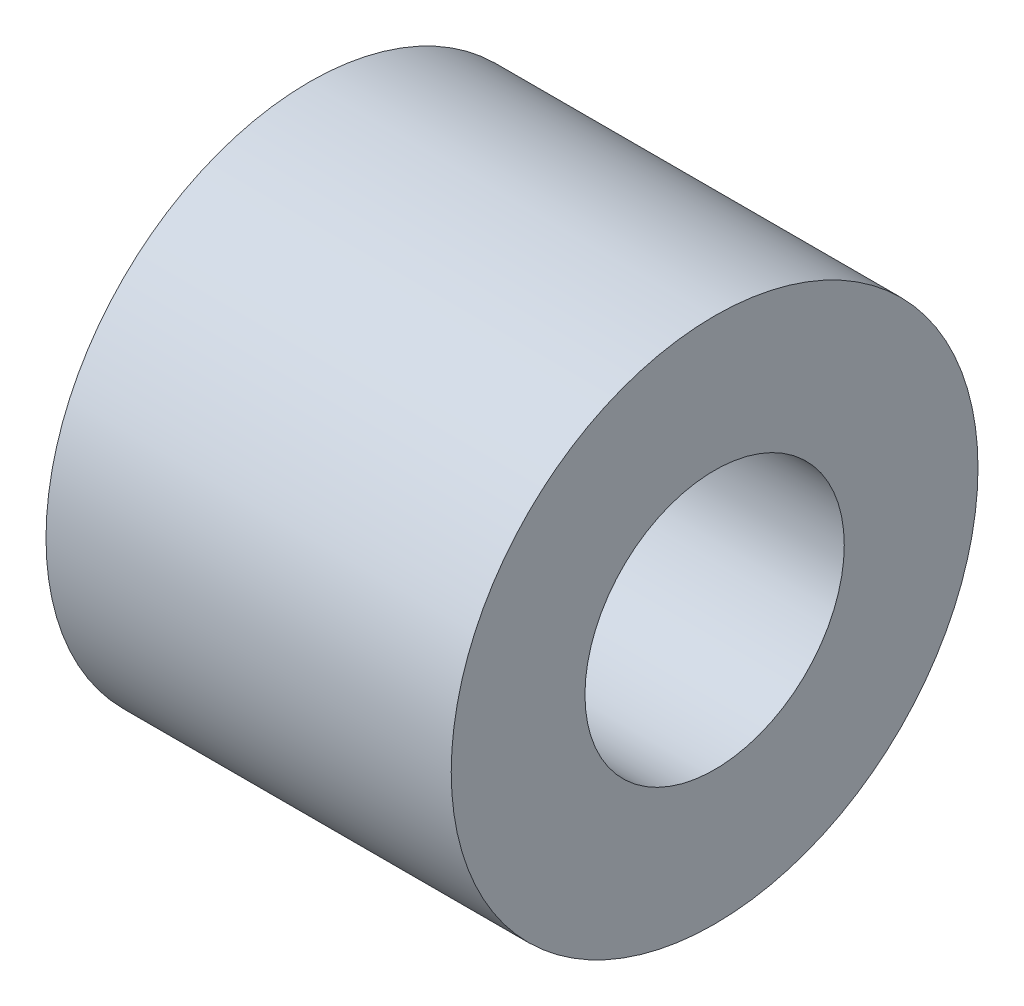
ISO-10303-21;
HEADER;
FILE_DESCRIPTION(('STEP AP214'),'2;1');
FILE_NAME('part.step','',(''),(''),'','','');
FILE_SCHEMA(('AUTOMOTIVE_DESIGN { 1 0 10303 214 1 1 1 1 }'));
ENDSEC;
DATA;
#1=APPLICATION_CONTEXT('core data for automotive mechanical design processes');
#2=APPLICATION_PROTOCOL_DEFINITION('international standard','automotive_design',2000,#1);
#3=PRODUCT_CONTEXT('',#1,'mechanical');
#4=PRODUCT('Part','Part','',(#3));
#5=PRODUCT_RELATED_PRODUCT_CATEGORY('part','',(#4));
#6=PRODUCT_DEFINITION_FORMATION('','',#4);
#7=PRODUCT_DEFINITION_CONTEXT('part definition',#1,'design');
#8=PRODUCT_DEFINITION('design','',#6,#7);
#9=PRODUCT_DEFINITION_SHAPE('','',#8);
#10=(LENGTH_UNIT() NAMED_UNIT(*) SI_UNIT(.MILLI.,.METRE.));
#11=(NAMED_UNIT(*) PLANE_ANGLE_UNIT() SI_UNIT($,.RADIAN.));
#12=(NAMED_UNIT(*) SI_UNIT($,.STERADIAN.) SOLID_ANGLE_UNIT());
#13=UNCERTAINTY_MEASURE_WITH_UNIT(LENGTH_MEASURE(1.E-05),#10,'distance_accuracy_value','');
#14=(GEOMETRIC_REPRESENTATION_CONTEXT(3) GLOBAL_UNCERTAINTY_ASSIGNED_CONTEXT((#13)) GLOBAL_UNIT_ASSIGNED_CONTEXT((#10,
#11,#12)) REPRESENTATION_CONTEXT('',''));
#15=CARTESIAN_POINT('',(0.,0.,0.));
#16=DIRECTION('',(0.,0.,1.));
#17=DIRECTION('',(1.,0.,0.));
#18=AXIS2_PLACEMENT_3D('',#15,#16,#17);
#19=CARTESIAN_POINT('',(10.,0.,0.));
#20=DIRECTION('',(1.,0.,0.));
#21=DIRECTION('',(0.,0.,-1.));
#22=AXIS2_PLACEMENT_3D('',#19,#20,#21);
#23=PLANE('',#22);
#24=CARTESIAN_POINT('',(10.,0.,0.));
#25=DIRECTION('',(1.,0.,0.));
#26=DIRECTION('',(0.,0.,-1.));
#27=AXIS2_PLACEMENT_3D('',#24,#25,#26);
#28=CIRCLE('',#27,6.5);
#29=CARTESIAN_POINT('',(10.,0.,-6.5));
#30=VERTEX_POINT('',#29);
#31=EDGE_CURVE('E10',#30,#30,#28,.T.);
#32=ORIENTED_EDGE('',*,*,#31,.T.);
#33=EDGE_LOOP('',(#32));
#34=FACE_BOUND('',#33,.T.);
#35=CARTESIAN_POINT('',(10.,0.,0.));
#36=DIRECTION('',(1.,0.,0.));
#37=DIRECTION('',(0.,0.,-1.));
#38=AXIS2_PLACEMENT_3D('',#35,#36,#37);
#39=CIRCLE('',#38,3.2);
#40=CARTESIAN_POINT('',(10.,0.,-3.2));
#41=VERTEX_POINT('',#40);
#42=EDGE_CURVE('E42',#41,#41,#39,.T.);
#43=ORIENTED_EDGE('',*,*,#42,.F.);
#44=EDGE_LOOP('',(#43));
#45=FACE_BOUND('',#44,.T.);
#46=ADVANCED_FACE('F31',(#34,#45),#23,.T.);
#47=CARTESIAN_POINT('',(0.,0.,0.));
#48=DIRECTION('',(1.,0.,0.));
#49=DIRECTION('',(0.,0.,-1.));
#50=AXIS2_PLACEMENT_3D('',#47,#48,#49);
#51=PLANE('',#50);
#52=CARTESIAN_POINT('',(0.,0.,0.));
#53=DIRECTION('',(1.,0.,0.));
#54=DIRECTION('',(0.,0.,-1.));
#55=AXIS2_PLACEMENT_3D('',#52,#53,#54);
#56=CIRCLE('',#55,6.5);
#57=CARTESIAN_POINT('',(0.,0.,-6.5));
#58=VERTEX_POINT('',#57);
#59=EDGE_CURVE('E35',#58,#58,#56,.T.);
#60=ORIENTED_EDGE('',*,*,#59,.F.);
#61=EDGE_LOOP('',(#60));
#62=FACE_BOUND('',#61,.T.);
#63=CARTESIAN_POINT('',(0.,0.,0.));
#64=DIRECTION('',(1.,0.,0.));
#65=DIRECTION('',(0.,0.,-1.));
#66=AXIS2_PLACEMENT_3D('',#63,#64,#65);
#67=CIRCLE('',#66,3.2);
#68=CARTESIAN_POINT('',(0.,0.,-3.2));
#69=VERTEX_POINT('',#68);
#70=EDGE_CURVE('E44',#69,#69,#67,.T.);
#71=ORIENTED_EDGE('',*,*,#70,.T.);
#72=EDGE_LOOP('',(#71));
#73=FACE_BOUND('',#72,.T.);
#74=ADVANCED_FACE('F54',(#62,#73),#51,.F.);
#75=CARTESIAN_POINT('',(10.,0.,0.));
#76=DIRECTION('',(-1.,0.,0.));
#77=DIRECTION('',(0.,0.,1.));
#78=AXIS2_PLACEMENT_3D('',#75,#76,#77);
#79=CYLINDRICAL_SURFACE('',#78,6.5);
#80=ORIENTED_EDGE('',*,*,#31,.F.);
#81=EDGE_LOOP('',(#80));
#82=FACE_BOUND('',#81,.T.);
#83=ORIENTED_EDGE('',*,*,#59,.T.);
#84=EDGE_LOOP('',(#83));
#85=FACE_BOUND('',#84,.T.);
#86=ADVANCED_FACE('F33',(#82,#85),#79,.T.);
#87=CARTESIAN_POINT('',(10.,0.,0.));
#88=DIRECTION('',(-1.,0.,0.));
#89=DIRECTION('',(0.,0.,1.));
#90=AXIS2_PLACEMENT_3D('',#87,#88,#89);
#91=CYLINDRICAL_SURFACE('',#90,3.2);
#92=ORIENTED_EDGE('',*,*,#42,.T.);
#93=EDGE_LOOP('',(#92));
#94=FACE_BOUND('',#93,.T.);
#95=ORIENTED_EDGE('',*,*,#70,.F.);
#96=EDGE_LOOP('',(#95));
#97=FACE_BOUND('',#96,.T.);
#98=ADVANCED_FACE('F50',(#94,#97),#91,.F.);
#99=CLOSED_SHELL('',(#46,#74,#86,#98));
#100=MANIFOLD_SOLID_BREP('B2',#99);
#101=ADVANCED_BREP_SHAPE_REPRESENTATION('',(#18,#100),#14);
#102=SHAPE_DEFINITION_REPRESENTATION(#9,#101);
ENDSEC;
END-ISO-10303-21;
